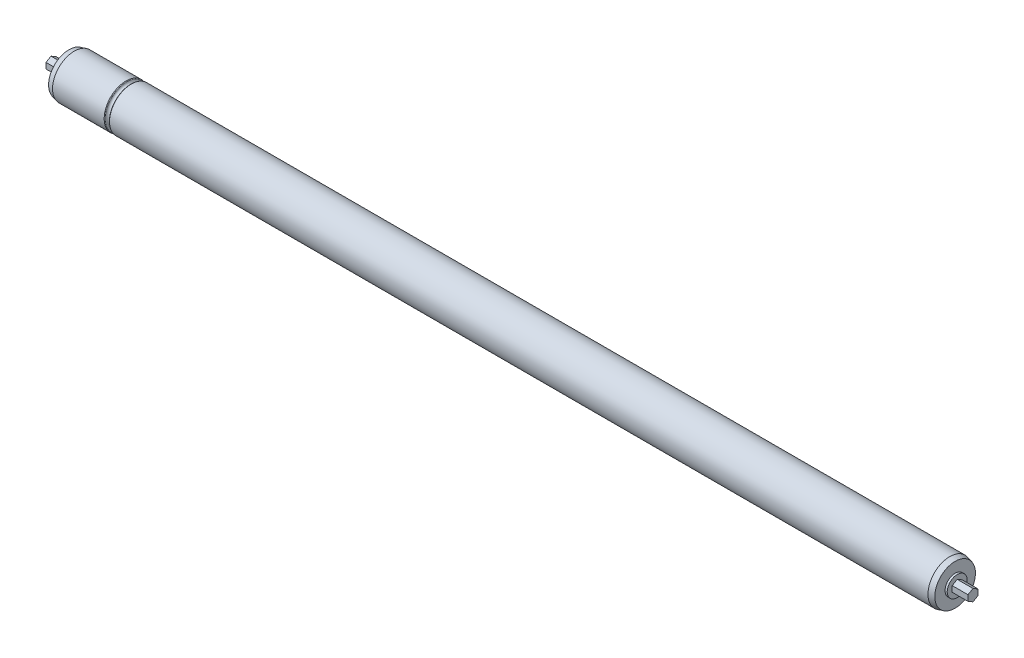
ISO-10303-21;
HEADER;
FILE_DESCRIPTION(('STEP AP214'),'2;1');
FILE_NAME('part.step','',(''),(''),'','','');
FILE_SCHEMA(('AUTOMOTIVE_DESIGN { 1 0 10303 214 1 1 1 1 }'));
ENDSEC;
DATA;
#1=APPLICATION_CONTEXT('core data for automotive mechanical design processes');
#2=APPLICATION_PROTOCOL_DEFINITION('international standard','automotive_design',2000,#1);
#3=PRODUCT_CONTEXT('',#1,'mechanical');
#4=PRODUCT('Part','Part','',(#3));
#5=PRODUCT_RELATED_PRODUCT_CATEGORY('part','',(#4));
#6=PRODUCT_DEFINITION_FORMATION('','',#4);
#7=PRODUCT_DEFINITION_CONTEXT('part definition',#1,'design');
#8=PRODUCT_DEFINITION('design','',#6,#7);
#9=PRODUCT_DEFINITION_SHAPE('','',#8);
#10=(LENGTH_UNIT() NAMED_UNIT(*) SI_UNIT(.MILLI.,.METRE.));
#11=(NAMED_UNIT(*) PLANE_ANGLE_UNIT() SI_UNIT($,.RADIAN.));
#12=(NAMED_UNIT(*) SI_UNIT($,.STERADIAN.) SOLID_ANGLE_UNIT());
#13=UNCERTAINTY_MEASURE_WITH_UNIT(LENGTH_MEASURE(1.E-05),#10,'distance_accuracy_value','');
#14=(GEOMETRIC_REPRESENTATION_CONTEXT(3) GLOBAL_UNCERTAINTY_ASSIGNED_CONTEXT((#13)) GLOBAL_UNIT_ASSIGNED_CONTEXT((#10,
#11,#12)) REPRESENTATION_CONTEXT('',''));
#15=CARTESIAN_POINT('',(0.,0.,0.));
#16=DIRECTION('',(0.,0.,1.));
#17=DIRECTION('',(1.,0.,0.));
#18=AXIS2_PLACEMENT_3D('',#15,#16,#17);
#19=CARTESIAN_POINT('',(-490.140625,0.,0.));
#20=DIRECTION('',(1.,0.,0.));
#21=DIRECTION('',(0.,0.,-1.));
#22=AXIS2_PLACEMENT_3D('',#19,#20,#21);
#23=CYLINDRICAL_SURFACE('',#22,24.13);
#24=CARTESIAN_POINT('',(485.400920474388,0.,0.));
#25=DIRECTION('',(-1.,0.,0.));
#26=DIRECTION('',(0.,0.,1.));
#27=AXIS2_PLACEMENT_3D('',#24,#25,#26);
#28=CIRCLE('',#27,24.13);
#29=CARTESIAN_POINT('',(485.400920474388,0.,24.13));
#30=VERTEX_POINT('',#29);
#31=EDGE_CURVE('E232',#30,#30,#28,.T.);
#32=ORIENTED_EDGE('',*,*,#31,.T.);
#33=EDGE_LOOP('',(#32));
#34=FACE_BOUND('',#33,.T.);
#35=CARTESIAN_POINT('',(-422.162230341776,1.62615661217587E-13,0.));
#36=DIRECTION('',(1.,0.,0.));
#37=DIRECTION('',(0.,1.,0.));
#38=AXIS2_PLACEMENT_3D('',#35,#36,#37);
#39=CIRCLE('',#38,24.13);
#40=CARTESIAN_POINT('',(-422.162230341776,24.1300000000002,0.));
#41=VERTEX_POINT('',#40);
#42=EDGE_CURVE('E40',#41,#41,#39,.T.);
#43=ORIENTED_EDGE('',*,*,#42,.T.);
#44=EDGE_LOOP('',(#43));
#45=FACE_BOUND('',#44,.T.);
#46=ADVANCED_FACE('F37',(#34,#45),#23,.T.);
#47=CARTESIAN_POINT('',(491.33125,0.,0.));
#48=DIRECTION('',(-1.,0.,0.));
#49=DIRECTION('',(0.,0.,-1.));
#50=AXIS2_PLACEMENT_3D('',#47,#48,#49);
#51=CONICAL_SURFACE('',#50,22.5409729927617,0.26179938779915);
#52=ORIENTED_EDGE('',*,*,#31,.F.);
#53=EDGE_LOOP('',(#52));
#54=FACE_BOUND('',#53,.T.);
#55=CARTESIAN_POINT('',(491.33125,0.,0.));
#56=DIRECTION('',(-1.,0.,0.));
#57=DIRECTION('',(0.,-1.,0.));
#58=AXIS2_PLACEMENT_3D('',#55,#56,#57);
#59=CIRCLE('',#58,22.5409729927617);
#60=CARTESIAN_POINT('',(491.33125,-22.5409729927617,0.));
#61=VERTEX_POINT('',#60);
#62=EDGE_CURVE('E245',#61,#61,#59,.T.);
#63=ORIENTED_EDGE('',*,*,#62,.T.);
#64=EDGE_LOOP('',(#63));
#65=FACE_BOUND('',#64,.T.);
#66=ADVANCED_FACE('F271',(#54,#65),#51,.T.);
#67=CARTESIAN_POINT('',(493.7125,0.,0.));
#68=DIRECTION('',(-1.,0.,0.));
#69=DIRECTION('',(0.,1.,0.));
#70=AXIS2_PLACEMENT_3D('',#67,#68,#69);
#71=PLANE('',#70);
#72=CARTESIAN_POINT('',(493.7125,0.,0.));
#73=DIRECTION('',(-1.,0.,0.));
#74=DIRECTION('',(0.,-1.,0.));
#75=AXIS2_PLACEMENT_3D('',#72,#73,#74);
#76=CIRCLE('',#75,11.1125);
#77=CARTESIAN_POINT('',(493.7125,-11.1125,0.));
#78=VERTEX_POINT('',#77);
#79=EDGE_CURVE('E157',#78,#78,#76,.T.);
#80=ORIENTED_EDGE('',*,*,#79,.F.);
#81=EDGE_LOOP('',(#80));
#82=FACE_BOUND('',#81,.T.);
#83=DIRECTION('',(0.,-0.5,-0.866025403784439));
#84=VECTOR('',#83,1.);
#85=CARTESIAN_POINT('',(493.7125,3.20790243318486,-5.55625));
#86=LINE('',#85,#84);
#87=CARTESIAN_POINT('',(493.7125,6.41580486636972,0.));
#88=VERTEX_POINT('',#87);
#89=CARTESIAN_POINT('',(493.7125,3.20790243318486,-5.55625));
#90=VERTEX_POINT('',#89);
#91=EDGE_CURVE('E12',#88,#90,#86,.T.);
#92=ORIENTED_EDGE('',*,*,#91,.T.);
#93=DIRECTION('',(0.,-1.,0.));
#94=VECTOR('',#93,1.);
#95=CARTESIAN_POINT('',(493.7125,-3.20790243318486,-5.55625));
#96=LINE('',#95,#94);
#97=CARTESIAN_POINT('',(493.7125,-3.20790243318486,-5.55625));
#98=VERTEX_POINT('',#97);
#99=EDGE_CURVE('E143',#90,#98,#96,.T.);
#100=ORIENTED_EDGE('',*,*,#99,.T.);
#101=DIRECTION('',(0.,-0.5,0.866025403784439));
#102=VECTOR('',#101,1.);
#103=CARTESIAN_POINT('',(493.7125,-6.41580486636972,0.));
#104=LINE('',#103,#102);
#105=CARTESIAN_POINT('',(493.7125,-6.41580486636972,0.));
#106=VERTEX_POINT('',#105);
#107=EDGE_CURVE('E53',#98,#106,#104,.T.);
#108=ORIENTED_EDGE('',*,*,#107,.T.);
#109=DIRECTION('',(0.,0.5,0.866025403784439));
#110=VECTOR('',#109,1.);
#111=CARTESIAN_POINT('',(493.7125,-3.20790243318486,5.55625));
#112=LINE('',#111,#110);
#113=CARTESIAN_POINT('',(493.7125,-3.20790243318486,5.55625));
#114=VERTEX_POINT('',#113);
#115=EDGE_CURVE('E61',#106,#114,#112,.T.);
#116=ORIENTED_EDGE('',*,*,#115,.T.);
#117=DIRECTION('',(0.,1.,0.));
#118=VECTOR('',#117,1.);
#119=CARTESIAN_POINT('',(493.7125,3.20790243318486,5.55625));
#120=LINE('',#119,#118);
#121=CARTESIAN_POINT('',(493.7125,3.20790243318486,5.55625));
#122=VERTEX_POINT('',#121);
#123=EDGE_CURVE('E153',#114,#122,#120,.T.);
#124=ORIENTED_EDGE('',*,*,#123,.T.);
#125=DIRECTION('',(0.,0.5,-0.866025403784439));
#126=VECTOR('',#125,1.);
#127=CARTESIAN_POINT('',(493.7125,6.41580486636972,0.));
#128=LINE('',#127,#126);
#129=EDGE_CURVE('E152',#122,#88,#128,.T.);
#130=ORIENTED_EDGE('',*,*,#129,.T.);
#131=EDGE_LOOP('',(#92,#100,#108,#116,#124,#130));
#132=FACE_BOUND('',#131,.T.);
#133=ADVANCED_FACE('F150',(#82,#132),#71,.F.);
#134=CARTESIAN_POINT('',(493.7125,0.,0.));
#135=DIRECTION('',(1.,0.,0.));
#136=DIRECTION('',(0.,-1.,0.));
#137=AXIS2_PLACEMENT_3D('',#134,#135,#136);
#138=CYLINDRICAL_SURFACE('',#137,11.1125);
#139=ORIENTED_EDGE('',*,*,#79,.T.);
#140=EDGE_LOOP('',(#139));
#141=FACE_BOUND('',#140,.T.);
#142=CARTESIAN_POINT('',(491.33125,0.,0.));
#143=DIRECTION('',(-1.,0.,0.));
#144=DIRECTION('',(0.,-1.,0.));
#145=AXIS2_PLACEMENT_3D('',#142,#143,#144);
#146=CIRCLE('',#145,11.1125);
#147=CARTESIAN_POINT('',(491.33125,-11.1125,0.));
#148=VERTEX_POINT('',#147);
#149=EDGE_CURVE('E161',#148,#148,#146,.T.);
#150=ORIENTED_EDGE('',*,*,#149,.F.);
#151=EDGE_LOOP('',(#150));
#152=FACE_BOUND('',#151,.T.);
#153=ADVANCED_FACE('F261',(#141,#152),#138,.T.);
#154=CARTESIAN_POINT('',(491.33125,-11.1125,0.));
#155=DIRECTION('',(-1.,0.,0.));
#156=DIRECTION('',(0.,1.,0.));
#157=AXIS2_PLACEMENT_3D('',#154,#155,#156);
#158=PLANE('',#157);
#159=ORIENTED_EDGE('',*,*,#149,.T.);
#160=EDGE_LOOP('',(#159));
#161=FACE_BOUND('',#160,.T.);
#162=ORIENTED_EDGE('',*,*,#62,.F.);
#163=EDGE_LOOP('',(#162));
#164=FACE_BOUND('',#163,.T.);
#165=ADVANCED_FACE('F258',(#161,#164),#158,.F.);
#166=CARTESIAN_POINT('',(511.175,6.41580486636972,0.));
#167=DIRECTION('',(1.,0.,0.));
#168=DIRECTION('',(0.,0.,-1.));
#169=AXIS2_PLACEMENT_3D('',#166,#167,#168);
#170=PLANE('',#169);
#171=DIRECTION('',(0.,0.5,0.866025403784439));
#172=VECTOR('',#171,1.);
#173=CARTESIAN_POINT('',(511.175,3.20790243318486,-5.55625));
#174=LINE('',#173,#172);
#175=CARTESIAN_POINT('',(511.175,3.20790243318486,-5.55625));
#176=VERTEX_POINT('',#175);
#177=CARTESIAN_POINT('',(511.175,6.41580486636972,0.));
#178=VERTEX_POINT('',#177);
#179=EDGE_CURVE('E136',#176,#178,#174,.T.);
#180=ORIENTED_EDGE('',*,*,#179,.T.);
#181=DIRECTION('',(0.,-0.5,0.866025403784439));
#182=VECTOR('',#181,1.);
#183=CARTESIAN_POINT('',(511.175,6.41580486636972,0.));
#184=LINE('',#183,#182);
#185=CARTESIAN_POINT('',(511.175,3.20790243318486,5.55625));
#186=VERTEX_POINT('',#185);
#187=EDGE_CURVE('E209',#178,#186,#184,.T.);
#188=ORIENTED_EDGE('',*,*,#187,.T.);
#189=DIRECTION('',(0.,-1.,0.));
#190=VECTOR('',#189,1.);
#191=CARTESIAN_POINT('',(511.175,3.20790243318486,5.55625));
#192=LINE('',#191,#190);
#193=CARTESIAN_POINT('',(511.175,-3.20790243318486,5.55625));
#194=VERTEX_POINT('',#193);
#195=EDGE_CURVE('E211',#186,#194,#192,.T.);
#196=ORIENTED_EDGE('',*,*,#195,.T.);
#197=DIRECTION('',(0.,-0.5,-0.866025403784439));
#198=VECTOR('',#197,1.);
#199=CARTESIAN_POINT('',(511.175,-3.20790243318486,5.55625));
#200=LINE('',#199,#198);
#201=CARTESIAN_POINT('',(511.175,-6.41580486636972,0.));
#202=VERTEX_POINT('',#201);
#203=EDGE_CURVE('E213',#194,#202,#200,.T.);
#204=ORIENTED_EDGE('',*,*,#203,.T.);
#205=DIRECTION('',(0.,0.5,-0.866025403784439));
#206=VECTOR('',#205,1.);
#207=CARTESIAN_POINT('',(511.175,-6.41580486636972,0.));
#208=LINE('',#207,#206);
#209=CARTESIAN_POINT('',(511.175,-3.20790243318486,-5.55625));
#210=VERTEX_POINT('',#209);
#211=EDGE_CURVE('E215',#202,#210,#208,.T.);
#212=ORIENTED_EDGE('',*,*,#211,.T.);
#213=DIRECTION('',(0.,1.,0.));
#214=VECTOR('',#213,1.);
#215=CARTESIAN_POINT('',(511.175,-3.20790243318486,-5.55625));
#216=LINE('',#215,#214);
#217=EDGE_CURVE('E217',#210,#176,#216,.T.);
#218=ORIENTED_EDGE('',*,*,#217,.T.);
#219=EDGE_LOOP('',(#180,#188,#196,#204,#212,#218));
#220=FACE_BOUND('',#219,.T.);
#221=ADVANCED_FACE('F269',(#220),#170,.T.);
#222=CARTESIAN_POINT('',(511.175,3.20790243318486,-5.55625));
#223=DIRECTION('',(0.,-0.866025403784439,0.5));
#224=DIRECTION('',(0.,-0.5,-0.866025403784439));
#225=AXIS2_PLACEMENT_3D('',#222,#223,#224);
#226=PLANE('',#225);
#227=ORIENTED_EDGE('',*,*,#91,.F.);
#228=DIRECTION('',(-1.,0.,0.));
#229=VECTOR('',#228,1.);
#230=CARTESIAN_POINT('',(511.175,6.41580486636972,0.));
#231=LINE('',#230,#229);
#232=EDGE_CURVE('E230',#178,#88,#231,.T.);
#233=ORIENTED_EDGE('',*,*,#232,.F.);
#234=ORIENTED_EDGE('',*,*,#179,.F.);
#235=DIRECTION('',(-1.,0.,0.));
#236=VECTOR('',#235,1.);
#237=CARTESIAN_POINT('',(511.175,3.20790243318486,-5.55625));
#238=LINE('',#237,#236);
#239=EDGE_CURVE('E130',#176,#90,#238,.T.);
#240=ORIENTED_EDGE('',*,*,#239,.T.);
#241=EDGE_LOOP('',(#227,#233,#234,#240));
#242=FACE_BOUND('',#241,.T.);
#243=ADVANCED_FACE('F132',(#242),#226,.F.);
#244=CARTESIAN_POINT('',(511.175,6.41580486636972,0.));
#245=DIRECTION('',(0.,-0.866025403784439,-0.5));
#246=DIRECTION('',(0.,0.5,-0.866025403784439));
#247=AXIS2_PLACEMENT_3D('',#244,#245,#246);
#248=PLANE('',#247);
#249=ORIENTED_EDGE('',*,*,#129,.F.);
#250=DIRECTION('',(-1.,0.,0.));
#251=VECTOR('',#250,1.);
#252=CARTESIAN_POINT('',(511.175,3.20790243318486,5.55625));
#253=LINE('',#252,#251);
#254=EDGE_CURVE('E227',#186,#122,#253,.T.);
#255=ORIENTED_EDGE('',*,*,#254,.F.);
#256=ORIENTED_EDGE('',*,*,#187,.F.);
#257=ORIENTED_EDGE('',*,*,#232,.T.);
#258=EDGE_LOOP('',(#249,#255,#256,#257));
#259=FACE_BOUND('',#258,.T.);
#260=ADVANCED_FACE('F333',(#259),#248,.F.);
#261=CARTESIAN_POINT('',(511.175,3.20790243318486,5.55625));
#262=DIRECTION('',(0.,0.,-1.));
#263=DIRECTION('',(-1.,0.,0.));
#264=AXIS2_PLACEMENT_3D('',#261,#262,#263);
#265=PLANE('',#264);
#266=ORIENTED_EDGE('',*,*,#123,.F.);
#267=DIRECTION('',(-1.,0.,0.));
#268=VECTOR('',#267,1.);
#269=CARTESIAN_POINT('',(511.175,-3.20790243318486,5.55625));
#270=LINE('',#269,#268);
#271=EDGE_CURVE('E224',#194,#114,#270,.T.);
#272=ORIENTED_EDGE('',*,*,#271,.F.);
#273=ORIENTED_EDGE('',*,*,#195,.F.);
#274=ORIENTED_EDGE('',*,*,#254,.T.);
#275=EDGE_LOOP('',(#266,#272,#273,#274));
#276=FACE_BOUND('',#275,.T.);
#277=ADVANCED_FACE('F329',(#276),#265,.F.);
#278=CARTESIAN_POINT('',(511.175,-3.20790243318486,5.55625));
#279=DIRECTION('',(0.,0.866025403784439,-0.5));
#280=DIRECTION('',(0.,0.5,0.866025403784439));
#281=AXIS2_PLACEMENT_3D('',#278,#279,#280);
#282=PLANE('',#281);
#283=ORIENTED_EDGE('',*,*,#115,.F.);
#284=DIRECTION('',(-1.,0.,0.));
#285=VECTOR('',#284,1.);
#286=CARTESIAN_POINT('',(511.175,-6.41580486636972,0.));
#287=LINE('',#286,#285);
#288=EDGE_CURVE('E221',#202,#106,#287,.T.);
#289=ORIENTED_EDGE('',*,*,#288,.F.);
#290=ORIENTED_EDGE('',*,*,#203,.F.);
#291=ORIENTED_EDGE('',*,*,#271,.T.);
#292=EDGE_LOOP('',(#283,#289,#290,#291));
#293=FACE_BOUND('',#292,.T.);
#294=ADVANCED_FACE('F326',(#293),#282,.F.);
#295=CARTESIAN_POINT('',(511.175,-6.41580486636972,0.));
#296=DIRECTION('',(0.,0.866025403784439,0.5));
#297=DIRECTION('',(0.,-0.5,0.866025403784439));
#298=AXIS2_PLACEMENT_3D('',#295,#296,#297);
#299=PLANE('',#298);
#300=ORIENTED_EDGE('',*,*,#107,.F.);
#301=DIRECTION('',(-1.,0.,0.));
#302=VECTOR('',#301,1.);
#303=CARTESIAN_POINT('',(511.175,-3.20790243318486,-5.55625));
#304=LINE('',#303,#302);
#305=EDGE_CURVE('E145',#210,#98,#304,.T.);
#306=ORIENTED_EDGE('',*,*,#305,.F.);
#307=ORIENTED_EDGE('',*,*,#211,.F.);
#308=ORIENTED_EDGE('',*,*,#288,.T.);
#309=EDGE_LOOP('',(#300,#306,#307,#308));
#310=FACE_BOUND('',#309,.T.);
#311=ADVANCED_FACE('F323',(#310),#299,.F.);
#312=CARTESIAN_POINT('',(511.175,-3.20790243318486,-5.55625));
#313=DIRECTION('',(0.,0.,1.));
#314=DIRECTION('',(1.,0.,0.));
#315=AXIS2_PLACEMENT_3D('',#312,#313,#314);
#316=PLANE('',#315);
#317=ORIENTED_EDGE('',*,*,#99,.F.);
#318=ORIENTED_EDGE('',*,*,#239,.F.);
#319=ORIENTED_EDGE('',*,*,#217,.F.);
#320=ORIENTED_EDGE('',*,*,#305,.T.);
#321=EDGE_LOOP('',(#317,#318,#319,#320));
#322=FACE_BOUND('',#321,.T.);
#323=ADVANCED_FACE('F144',(#322),#316,.F.);
#324=CARTESIAN_POINT('',(-421.96385,1.6306400674182E-13,0.));
#325=DIRECTION('',(-1.,0.,0.));
#326=DIRECTION('',(0.,-1.,0.));
#327=AXIS2_PLACEMENT_3D('',#324,#325,#326);
#328=TOROIDAL_SURFACE('',#327,23.3680000000021,0.787399999999997);
#329=ORIENTED_EDGE('',*,*,#42,.F.);
#330=EDGE_LOOP('',(#329));
#331=FACE_BOUND('',#330,.T.);
#332=CARTESIAN_POINT('',(-422.75125,1.60374553983882E-13,0.));
#333=DIRECTION('',(-1.,0.,0.));
#334=DIRECTION('',(0.,-1.,0.));
#335=AXIS2_PLACEMENT_3D('',#332,#333,#334);
#336=CIRCLE('',#335,23.3680000000021);
#337=CARTESIAN_POINT('',(-422.75125,-23.3680000000019,0.));
#338=VERTEX_POINT('',#337);
#339=EDGE_CURVE('E241',#338,#338,#336,.T.);
#340=ORIENTED_EDGE('',*,*,#339,.F.);
#341=EDGE_LOOP('',(#340));
#342=FACE_BOUND('',#341,.T.);
#343=ADVANCED_FACE('F322',(#331,#342),#328,.T.);
#344=CARTESIAN_POINT('',(-425.1325,1.56125112837913E-13,0.));
#345=DIRECTION('',(-1.,0.,0.));
#346=DIRECTION('',(0.,-1.,0.));
#347=AXIS2_PLACEMENT_3D('',#344,#345,#346);
#348=TOROIDAL_SURFACE('',#347,23.3680000000021,2.38125);
#349=ORIENTED_EDGE('',*,*,#339,.T.);
#350=EDGE_LOOP('',(#349));
#351=FACE_BOUND('',#350,.T.);
#352=CARTESIAN_POINT('',(-427.51375,1.49611161099058E-13,0.));
#353=DIRECTION('',(-1.,0.,0.));
#354=DIRECTION('',(0.,-1.,0.));
#355=AXIS2_PLACEMENT_3D('',#352,#353,#354);
#356=CIRCLE('',#355,23.3680000000021);
#357=CARTESIAN_POINT('',(-427.51375,-23.3680000000019,0.));
#358=VERTEX_POINT('',#357);
#359=EDGE_CURVE('E247',#358,#358,#356,.T.);
#360=ORIENTED_EDGE('',*,*,#359,.F.);
#361=EDGE_LOOP('',(#360));
#362=FACE_BOUND('',#361,.T.);
#363=ADVANCED_FACE('F385',(#351,#362),#348,.F.);
#364=CARTESIAN_POINT('',(-428.30115,1.49186218934005E-13,0.));
#365=DIRECTION('',(-1.,0.,0.));
#366=DIRECTION('',(0.,-1.,0.));
#367=AXIS2_PLACEMENT_3D('',#364,#365,#366);
#368=TOROIDAL_SURFACE('',#367,23.3680000000021,0.787399999999997);
#369=CARTESIAN_POINT('',(-428.102769658224,1.49634564458239E-13,0.));
#370=DIRECTION('',(-1.,0.,0.));
#371=DIRECTION('',(0.,-1.,0.));
#372=AXIS2_PLACEMENT_3D('',#369,#370,#371);
#373=CIRCLE('',#372,24.13);
#374=CARTESIAN_POINT('',(-428.102769658224,-24.1299999999998,0.));
#375=VERTEX_POINT('',#374);
#376=EDGE_CURVE('E239',#375,#375,#373,.T.);
#377=ORIENTED_EDGE('',*,*,#376,.F.);
#378=EDGE_LOOP('',(#377));
#379=FACE_BOUND('',#378,.T.);
#380=ORIENTED_EDGE('',*,*,#359,.T.);
#381=EDGE_LOOP('',(#380));
#382=FACE_BOUND('',#381,.T.);
#383=ADVANCED_FACE('F315',(#379,#382),#368,.T.);
#384=CARTESIAN_POINT('',(-511.175,6.41580486636972,0.));
#385=DIRECTION('',(1.,0.,0.));
#386=DIRECTION('',(0.,0.,-1.));
#387=AXIS2_PLACEMENT_3D('',#384,#385,#386);
#388=PLANE('',#387);
#389=DIRECTION('',(0.,0.5,0.866025403784439));
#390=VECTOR('',#389,1.);
#391=CARTESIAN_POINT('',(-511.175,3.20790243318486,-5.55625));
#392=LINE('',#391,#390);
#393=CARTESIAN_POINT('',(-511.175,3.20790243318486,-5.55625));
#394=VERTEX_POINT('',#393);
#395=CARTESIAN_POINT('',(-511.175,6.41580486636972,0.));
#396=VERTEX_POINT('',#395);
#397=EDGE_CURVE('E190',#394,#396,#392,.T.);
#398=ORIENTED_EDGE('',*,*,#397,.F.);
#399=DIRECTION('',(0.,1.,0.));
#400=VECTOR('',#399,1.);
#401=CARTESIAN_POINT('',(-511.175,-3.20790243318486,-5.55625));
#402=LINE('',#401,#400);
#403=CARTESIAN_POINT('',(-511.175,-3.20790243318486,-5.55625));
#404=VERTEX_POINT('',#403);
#405=EDGE_CURVE('E205',#404,#394,#402,.T.);
#406=ORIENTED_EDGE('',*,*,#405,.F.);
#407=DIRECTION('',(0.,0.5,-0.866025403784439));
#408=VECTOR('',#407,1.);
#409=CARTESIAN_POINT('',(-511.175,-6.41580486636972,0.));
#410=LINE('',#409,#408);
#411=CARTESIAN_POINT('',(-511.175,-6.41580486636972,0.));
#412=VERTEX_POINT('',#411);
#413=EDGE_CURVE('E202',#412,#404,#410,.T.);
#414=ORIENTED_EDGE('',*,*,#413,.F.);
#415=DIRECTION('',(0.,-0.5,-0.866025403784439));
#416=VECTOR('',#415,1.);
#417=CARTESIAN_POINT('',(-511.175,-3.20790243318486,5.55625));
#418=LINE('',#417,#416);
#419=CARTESIAN_POINT('',(-511.175,-3.20790243318486,5.55625));
#420=VERTEX_POINT('',#419);
#421=EDGE_CURVE('E199',#420,#412,#418,.T.);
#422=ORIENTED_EDGE('',*,*,#421,.F.);
#423=DIRECTION('',(0.,-1.,0.));
#424=VECTOR('',#423,1.);
#425=CARTESIAN_POINT('',(-511.175,3.20790243318486,5.55625));
#426=LINE('',#425,#424);
#427=CARTESIAN_POINT('',(-511.175,3.20790243318486,5.55625));
#428=VERTEX_POINT('',#427);
#429=EDGE_CURVE('E196',#428,#420,#426,.T.);
#430=ORIENTED_EDGE('',*,*,#429,.F.);
#431=DIRECTION('',(0.,-0.5,0.866025403784439));
#432=VECTOR('',#431,1.);
#433=CARTESIAN_POINT('',(-511.175,6.41580486636972,0.));
#434=LINE('',#433,#432);
#435=EDGE_CURVE('E193',#396,#428,#434,.T.);
#436=ORIENTED_EDGE('',*,*,#435,.F.);
#437=EDGE_LOOP('',(#398,#406,#414,#422,#430,#436));
#438=FACE_BOUND('',#437,.T.);
#439=ADVANCED_FACE('F311',(#438),#388,.F.);
#440=DIRECTION('',(0.,0.5,-0.866025403784439));
#441=VECTOR('',#440,1.);
#442=CARTESIAN_POINT('',(-493.7125,-6.41580486636972,0.));
#443=LINE('',#442,#441);
#444=CARTESIAN_POINT('',(-493.7125,-6.41580486636972,0.));
#445=VERTEX_POINT('',#444);
#446=CARTESIAN_POINT('',(-493.7125,-3.20790243318486,-5.55625));
#447=VERTEX_POINT('',#446);
#448=EDGE_CURVE('E175',#445,#447,#443,.T.);
#449=ORIENTED_EDGE('',*,*,#448,.F.);
#450=EDGE_CURVE('E220',#445,#412,#287,.T.);
#451=ORIENTED_EDGE('',*,*,#450,.T.);
#452=ORIENTED_EDGE('',*,*,#413,.T.);
#453=EDGE_CURVE('E139',#447,#404,#304,.T.);
#454=ORIENTED_EDGE('',*,*,#453,.F.);
#455=EDGE_LOOP('',(#449,#451,#452,#454));
#456=FACE_BOUND('',#455,.T.);
#457=ADVANCED_FACE('F314',(#456),#299,.F.);
#458=DIRECTION('',(0.,-0.5,-0.866025403784439));
#459=VECTOR('',#458,1.);
#460=CARTESIAN_POINT('',(-493.7125,-3.20790243318486,5.55625));
#461=LINE('',#460,#459);
#462=CARTESIAN_POINT('',(-493.7125,-3.20790243318486,5.55625));
#463=VERTEX_POINT('',#462);
#464=EDGE_CURVE('E178',#463,#445,#461,.T.);
#465=ORIENTED_EDGE('',*,*,#464,.F.);
#466=EDGE_CURVE('E223',#463,#420,#270,.T.);
#467=ORIENTED_EDGE('',*,*,#466,.T.);
#468=ORIENTED_EDGE('',*,*,#421,.T.);
#469=ORIENTED_EDGE('',*,*,#450,.F.);
#470=EDGE_LOOP('',(#465,#467,#468,#469));
#471=FACE_BOUND('',#470,.T.);
#472=ADVANCED_FACE('F330',(#471),#282,.F.);
#473=DIRECTION('',(0.,-1.,0.));
#474=VECTOR('',#473,1.);
#475=CARTESIAN_POINT('',(-493.7125,3.20790243318486,5.55625));
#476=LINE('',#475,#474);
#477=CARTESIAN_POINT('',(-493.7125,3.20790243318486,5.55625));
#478=VERTEX_POINT('',#477);
#479=EDGE_CURVE('E181',#478,#463,#476,.T.);
#480=ORIENTED_EDGE('',*,*,#479,.F.);
#481=EDGE_CURVE('E226',#478,#428,#253,.T.);
#482=ORIENTED_EDGE('',*,*,#481,.T.);
#483=ORIENTED_EDGE('',*,*,#429,.T.);
#484=ORIENTED_EDGE('',*,*,#466,.F.);
#485=EDGE_LOOP('',(#480,#482,#483,#484));
#486=FACE_BOUND('',#485,.T.);
#487=ADVANCED_FACE('F335',(#486),#265,.F.);
#488=DIRECTION('',(0.,-0.5,0.866025403784439));
#489=VECTOR('',#488,1.);
#490=CARTESIAN_POINT('',(-493.7125,6.41580486636972,0.));
#491=LINE('',#490,#489);
#492=CARTESIAN_POINT('',(-493.7125,6.41580486636972,0.));
#493=VERTEX_POINT('',#492);
#494=EDGE_CURVE('E184',#493,#478,#491,.T.);
#495=ORIENTED_EDGE('',*,*,#494,.F.);
#496=EDGE_CURVE('E229',#493,#396,#231,.T.);
#497=ORIENTED_EDGE('',*,*,#496,.T.);
#498=ORIENTED_EDGE('',*,*,#435,.T.);
#499=ORIENTED_EDGE('',*,*,#481,.F.);
#500=EDGE_LOOP('',(#495,#497,#498,#499));
#501=FACE_BOUND('',#500,.T.);
#502=ADVANCED_FACE('F338',(#501),#248,.F.);
#503=DIRECTION('',(0.,0.5,0.866025403784439));
#504=VECTOR('',#503,1.);
#505=CARTESIAN_POINT('',(-493.7125,3.20790243318486,-5.55625));
#506=LINE('',#505,#504);
#507=CARTESIAN_POINT('',(-493.7125,3.20790243318486,-5.55625));
#508=VERTEX_POINT('',#507);
#509=EDGE_CURVE('E187',#508,#493,#506,.T.);
#510=ORIENTED_EDGE('',*,*,#509,.F.);
#511=EDGE_CURVE('E140',#508,#394,#238,.T.);
#512=ORIENTED_EDGE('',*,*,#511,.T.);
#513=ORIENTED_EDGE('',*,*,#397,.T.);
#514=ORIENTED_EDGE('',*,*,#496,.F.);
#515=EDGE_LOOP('',(#510,#512,#513,#514));
#516=FACE_BOUND('',#515,.T.);
#517=ADVANCED_FACE('F340',(#516),#226,.F.);
#518=DIRECTION('',(0.,1.,0.));
#519=VECTOR('',#518,1.);
#520=CARTESIAN_POINT('',(-493.7125,-3.20790243318486,-5.55625));
#521=LINE('',#520,#519);
#522=EDGE_CURVE('E45',#447,#508,#521,.T.);
#523=ORIENTED_EDGE('',*,*,#522,.F.);
#524=ORIENTED_EDGE('',*,*,#453,.T.);
#525=ORIENTED_EDGE('',*,*,#405,.T.);
#526=ORIENTED_EDGE('',*,*,#511,.F.);
#527=EDGE_LOOP('',(#523,#524,#525,#526));
#528=FACE_BOUND('',#527,.T.);
#529=ADVANCED_FACE('F309',(#528),#316,.F.);
#530=CARTESIAN_POINT('',(-493.7125,0.,0.));
#531=DIRECTION('',(1.,0.,0.));
#532=DIRECTION('',(0.,1.,0.));
#533=AXIS2_PLACEMENT_3D('',#530,#531,#532);
#534=PLANE('',#533);
#535=CARTESIAN_POINT('',(-493.7125,0.,0.));
#536=DIRECTION('',(-1.,0.,0.));
#537=DIRECTION('',(0.,-1.,0.));
#538=AXIS2_PLACEMENT_3D('',#535,#536,#537);
#539=CIRCLE('',#538,11.1125);
#540=CARTESIAN_POINT('',(-493.7125,-11.1125,0.));
#541=VERTEX_POINT('',#540);
#542=EDGE_CURVE('E172',#541,#541,#539,.T.);
#543=ORIENTED_EDGE('',*,*,#542,.T.);
#544=EDGE_LOOP('',(#543));
#545=FACE_BOUND('',#544,.T.);
#546=ORIENTED_EDGE('',*,*,#522,.T.);
#547=ORIENTED_EDGE('',*,*,#509,.T.);
#548=ORIENTED_EDGE('',*,*,#494,.T.);
#549=ORIENTED_EDGE('',*,*,#479,.T.);
#550=ORIENTED_EDGE('',*,*,#464,.T.);
#551=ORIENTED_EDGE('',*,*,#448,.T.);
#552=EDGE_LOOP('',(#546,#547,#548,#549,#550,#551));
#553=FACE_BOUND('',#552,.T.);
#554=ADVANCED_FACE('F302',(#545,#553),#534,.F.);
#555=CARTESIAN_POINT('',(-493.7125,0.,0.));
#556=DIRECTION('',(-1.,0.,0.));
#557=DIRECTION('',(0.,-1.,0.));
#558=AXIS2_PLACEMENT_3D('',#555,#556,#557);
#559=CYLINDRICAL_SURFACE('',#558,11.1125);
#560=ORIENTED_EDGE('',*,*,#542,.F.);
#561=EDGE_LOOP('',(#560));
#562=FACE_BOUND('',#561,.T.);
#563=CARTESIAN_POINT('',(-491.33125,0.,0.));
#564=DIRECTION('',(-1.,0.,0.));
#565=DIRECTION('',(0.,-1.,0.));
#566=AXIS2_PLACEMENT_3D('',#563,#564,#565);
#567=CIRCLE('',#566,11.1125);
#568=CARTESIAN_POINT('',(-491.33125,-11.1125,0.));
#569=VERTEX_POINT('',#568);
#570=EDGE_CURVE('E169',#569,#569,#567,.T.);
#571=ORIENTED_EDGE('',*,*,#570,.T.);
#572=EDGE_LOOP('',(#571));
#573=FACE_BOUND('',#572,.T.);
#574=ADVANCED_FACE('F296',(#562,#573),#559,.T.);
#575=CARTESIAN_POINT('',(-491.33125,-11.1125,0.));
#576=DIRECTION('',(1.,0.,0.));
#577=DIRECTION('',(0.,1.,0.));
#578=AXIS2_PLACEMENT_3D('',#575,#576,#577);
#579=PLANE('',#578);
#580=ORIENTED_EDGE('',*,*,#570,.F.);
#581=EDGE_LOOP('',(#580));
#582=FACE_BOUND('',#581,.T.);
#583=CARTESIAN_POINT('',(-491.33125,0.,0.));
#584=DIRECTION('',(-1.,0.,0.));
#585=DIRECTION('',(0.,-1.,0.));
#586=AXIS2_PLACEMENT_3D('',#583,#584,#585);
#587=CIRCLE('',#586,22.5409729927617);
#588=CARTESIAN_POINT('',(-491.33125,-22.5409729927617,0.));
#589=VERTEX_POINT('',#588);
#590=EDGE_CURVE('E147',#589,#589,#587,.T.);
#591=ORIENTED_EDGE('',*,*,#590,.T.);
#592=EDGE_LOOP('',(#591));
#593=FACE_BOUND('',#592,.T.);
#594=ADVANCED_FACE('F289',(#582,#593),#579,.F.);
#595=CARTESIAN_POINT('',(-491.33125,0.,0.));
#596=DIRECTION('',(1.,0.,0.));
#597=DIRECTION('',(0.,0.,1.));
#598=AXIS2_PLACEMENT_3D('',#595,#596,#597);
#599=CONICAL_SURFACE('',#598,22.5409729927617,0.26179938779915);
#600=CARTESIAN_POINT('',(-485.400920474388,0.,0.));
#601=DIRECTION('',(1.,0.,0.));
#602=DIRECTION('',(0.,0.,-1.));
#603=AXIS2_PLACEMENT_3D('',#600,#601,#602);
#604=CIRCLE('',#603,24.13);
#605=CARTESIAN_POINT('',(-485.400920474388,0.,-24.13));
#606=VERTEX_POINT('',#605);
#607=EDGE_CURVE('E235',#606,#606,#604,.T.);
#608=ORIENTED_EDGE('',*,*,#607,.F.);
#609=EDGE_LOOP('',(#608));
#610=FACE_BOUND('',#609,.T.);
#611=ORIENTED_EDGE('',*,*,#590,.F.);
#612=EDGE_LOOP('',(#611));
#613=FACE_BOUND('',#612,.T.);
#614=ADVANCED_FACE('F284',(#610,#613),#599,.T.);
#615=ORIENTED_EDGE('',*,*,#607,.T.);
#616=EDGE_LOOP('',(#615));
#617=FACE_BOUND('',#616,.T.);
#618=ORIENTED_EDGE('',*,*,#376,.T.);
#619=EDGE_LOOP('',(#618));
#620=FACE_BOUND('',#619,.T.);
#621=ADVANCED_FACE('F276',(#617,#620),#23,.T.);
#622=CLOSED_SHELL('',(#46,#66,#133,#153,#165,#221,#243,#260,#277,#294,#311,#323,#343,#363,#383,
#439,#457,#472,#487,#502,#517,#529,#554,#574,#594,#614,#621));
#623=MANIFOLD_SOLID_BREP('B2',#622);
#624=ADVANCED_BREP_SHAPE_REPRESENTATION('',(#18,#623),#14);
#625=SHAPE_DEFINITION_REPRESENTATION(#9,#624);
ENDSEC;
END-ISO-10303-21;
